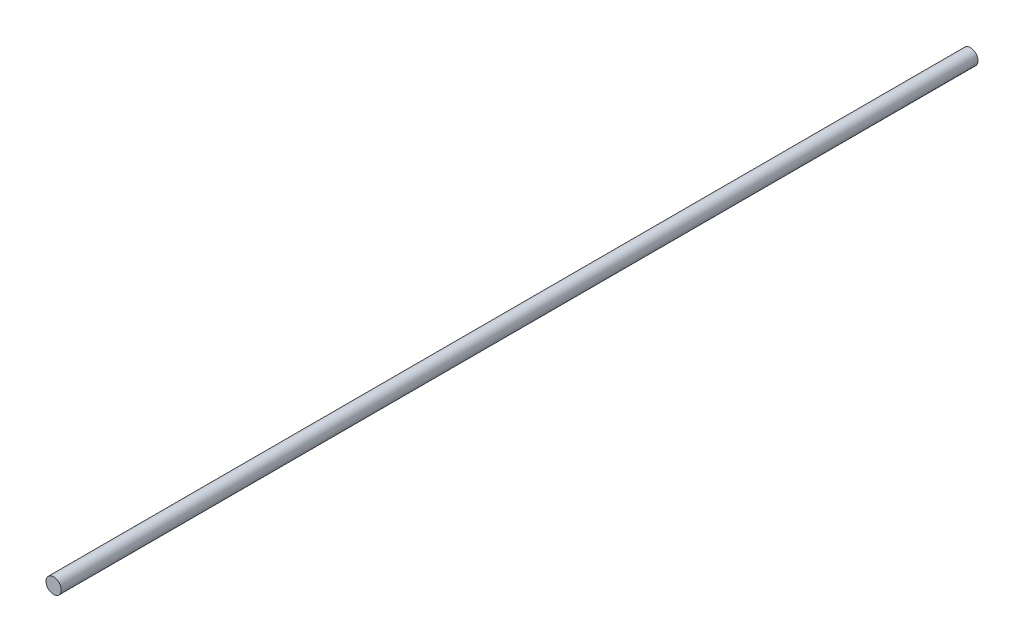
ISO-10303-21;
HEADER;
FILE_DESCRIPTION(('STEP AP214'),'2;1');
FILE_NAME('part.step','',(''),(''),'','','');
FILE_SCHEMA(('AUTOMOTIVE_DESIGN { 1 0 10303 214 1 1 1 1 }'));
ENDSEC;
DATA;
#1=APPLICATION_CONTEXT('core data for automotive mechanical design processes');
#2=APPLICATION_PROTOCOL_DEFINITION('international standard','automotive_design',2000,#1);
#3=PRODUCT_CONTEXT('',#1,'mechanical');
#4=PRODUCT('Part','Part','',(#3));
#5=PRODUCT_RELATED_PRODUCT_CATEGORY('part','',(#4));
#6=PRODUCT_DEFINITION_FORMATION('','',#4);
#7=PRODUCT_DEFINITION_CONTEXT('part definition',#1,'design');
#8=PRODUCT_DEFINITION('design','',#6,#7);
#9=PRODUCT_DEFINITION_SHAPE('','',#8);
#10=(LENGTH_UNIT() NAMED_UNIT(*) SI_UNIT(.MILLI.,.METRE.));
#11=(NAMED_UNIT(*) PLANE_ANGLE_UNIT() SI_UNIT($,.RADIAN.));
#12=(NAMED_UNIT(*) SI_UNIT($,.STERADIAN.) SOLID_ANGLE_UNIT());
#13=UNCERTAINTY_MEASURE_WITH_UNIT(LENGTH_MEASURE(1.E-05),#10,'distance_accuracy_value','');
#14=(GEOMETRIC_REPRESENTATION_CONTEXT(3) GLOBAL_UNCERTAINTY_ASSIGNED_CONTEXT((#13)) GLOBAL_UNIT_ASSIGNED_CONTEXT((#10,
#11,#12)) REPRESENTATION_CONTEXT('',''));
#15=CARTESIAN_POINT('',(0.,0.,0.));
#16=DIRECTION('',(0.,0.,1.));
#17=DIRECTION('',(1.,0.,0.));
#18=AXIS2_PLACEMENT_3D('',#15,#16,#17);
#19=CARTESIAN_POINT('',(0.,0.,60.));
#20=DIRECTION('',(0.,0.,-1.));
#21=DIRECTION('',(-1.,0.,0.));
#22=AXIS2_PLACEMENT_3D('',#19,#20,#21);
#23=CYLINDRICAL_SURFACE('',#22,0.5);
#24=CARTESIAN_POINT('',(0.,0.,60.));
#25=DIRECTION('',(0.,0.,1.));
#26=DIRECTION('',(1.,0.,0.));
#27=AXIS2_PLACEMENT_3D('',#24,#25,#26);
#28=CIRCLE('',#27,0.5);
#29=CARTESIAN_POINT('',(0.5,0.,60.));
#30=VERTEX_POINT('',#29);
#31=EDGE_CURVE('E10',#30,#30,#28,.T.);
#32=ORIENTED_EDGE('',*,*,#31,.F.);
#33=EDGE_LOOP('',(#32));
#34=FACE_BOUND('',#33,.T.);
#35=CARTESIAN_POINT('',(0.,0.,0.));
#36=DIRECTION('',(0.,0.,1.));
#37=DIRECTION('',(1.,0.,0.));
#38=AXIS2_PLACEMENT_3D('',#35,#36,#37);
#39=CIRCLE('',#38,0.5);
#40=CARTESIAN_POINT('',(0.5,0.,0.));
#41=VERTEX_POINT('',#40);
#42=EDGE_CURVE('E36',#41,#41,#39,.T.);
#43=ORIENTED_EDGE('',*,*,#42,.T.);
#44=EDGE_LOOP('',(#43));
#45=FACE_BOUND('',#44,.T.);
#46=ADVANCED_FACE('F33',(#34,#45),#23,.T.);
#47=CARTESIAN_POINT('',(0.,0.,60.));
#48=DIRECTION('',(0.,0.,1.));
#49=DIRECTION('',(1.,0.,0.));
#50=AXIS2_PLACEMENT_3D('',#47,#48,#49);
#51=PLANE('',#50);
#52=ORIENTED_EDGE('',*,*,#31,.T.);
#53=EDGE_LOOP('',(#52));
#54=FACE_BOUND('',#53,.T.);
#55=ADVANCED_FACE('F48',(#54),#51,.T.);
#56=CARTESIAN_POINT('',(0.,0.,0.));
#57=DIRECTION('',(0.,0.,1.));
#58=DIRECTION('',(1.,0.,0.));
#59=AXIS2_PLACEMENT_3D('',#56,#57,#58);
#60=PLANE('',#59);
#61=ORIENTED_EDGE('',*,*,#42,.F.);
#62=EDGE_LOOP('',(#61));
#63=FACE_BOUND('',#62,.T.);
#64=ADVANCED_FACE('F46',(#63),#60,.F.);
#65=CLOSED_SHELL('',(#46,#55,#64));
#66=MANIFOLD_SOLID_BREP('B2',#65);
#67=ADVANCED_BREP_SHAPE_REPRESENTATION('',(#18,#66),#14);
#68=SHAPE_DEFINITION_REPRESENTATION(#9,#67);
ENDSEC;
END-ISO-10303-21;
